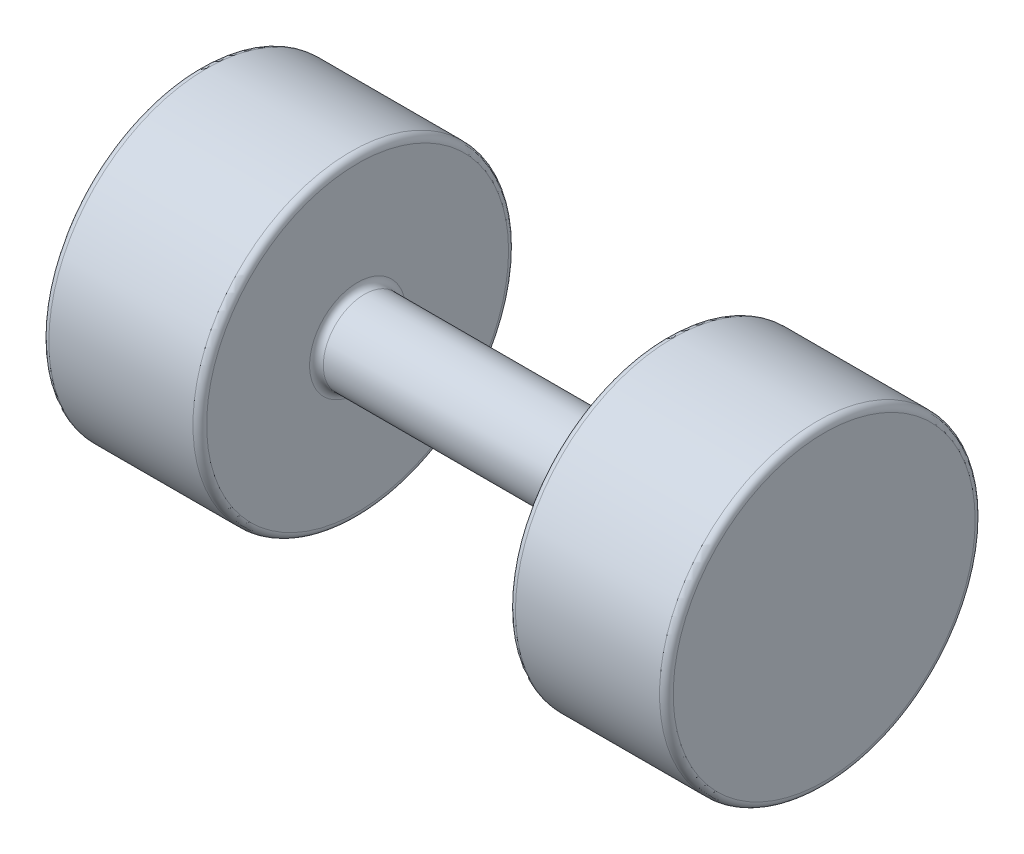
ISO-10303-21;
HEADER;
FILE_DESCRIPTION(('STEP AP214'),'2;1');
FILE_NAME('part.step','',(''),(''),'','','');
FILE_SCHEMA(('AUTOMOTIVE_DESIGN { 1 0 10303 214 1 1 1 1 }'));
ENDSEC;
DATA;
#1=APPLICATION_CONTEXT('core data for automotive mechanical design processes');
#2=APPLICATION_PROTOCOL_DEFINITION('international standard','automotive_design',2000,#1);
#3=PRODUCT_CONTEXT('',#1,'mechanical');
#4=PRODUCT('Part','Part','',(#3));
#5=PRODUCT_RELATED_PRODUCT_CATEGORY('part','',(#4));
#6=PRODUCT_DEFINITION_FORMATION('','',#4);
#7=PRODUCT_DEFINITION_CONTEXT('part definition',#1,'design');
#8=PRODUCT_DEFINITION('design','',#6,#7);
#9=PRODUCT_DEFINITION_SHAPE('','',#8);
#10=(LENGTH_UNIT() NAMED_UNIT(*) SI_UNIT(.MILLI.,.METRE.));
#11=(NAMED_UNIT(*) PLANE_ANGLE_UNIT() SI_UNIT($,.RADIAN.));
#12=(NAMED_UNIT(*) SI_UNIT($,.STERADIAN.) SOLID_ANGLE_UNIT());
#13=UNCERTAINTY_MEASURE_WITH_UNIT(LENGTH_MEASURE(1.E-05),#10,'distance_accuracy_value','');
#14=(GEOMETRIC_REPRESENTATION_CONTEXT(3) GLOBAL_UNCERTAINTY_ASSIGNED_CONTEXT((#13)) GLOBAL_UNIT_ASSIGNED_CONTEXT((#10,
#11,#12)) REPRESENTATION_CONTEXT('',''));
#15=CARTESIAN_POINT('',(0.,0.,0.));
#16=DIRECTION('',(0.,0.,1.));
#17=DIRECTION('',(1.,0.,0.));
#18=AXIS2_PLACEMENT_3D('',#15,#16,#17);
#19=CARTESIAN_POINT('',(91.,0.,0.));
#20=DIRECTION('',(1.,0.,0.));
#21=DIRECTION('',(0.,0.,-1.));
#22=AXIS2_PLACEMENT_3D('',#19,#20,#21);
#23=PLANE('',#22);
#24=CARTESIAN_POINT('',(91.,0.,0.));
#25=DIRECTION('',(1.,0.,0.));
#26=DIRECTION('',(0.,0.,-1.));
#27=AXIS2_PLACEMENT_3D('',#24,#25,#26);
#28=CIRCLE('',#27,44.);
#29=CARTESIAN_POINT('',(91.,0.,-44.));
#30=VERTEX_POINT('',#29);
#31=EDGE_CURVE('E58',#30,#30,#28,.T.);
#32=ORIENTED_EDGE('',*,*,#31,.T.);
#33=EDGE_LOOP('',(#32));
#34=FACE_BOUND('',#33,.T.);
#35=ADVANCED_FACE('F35',(#34),#23,.T.);
#36=CARTESIAN_POINT('',(91.,0.,0.));
#37=DIRECTION('',(1.,0.,0.));
#38=DIRECTION('',(0.,0.,-1.));
#39=AXIS2_PLACEMENT_3D('',#36,#37,#38);
#40=CYLINDRICAL_SURFACE('',#39,46.);
#41=CARTESIAN_POINT('',(89.,0.,0.));
#42=DIRECTION('',(1.,0.,0.));
#43=DIRECTION('',(0.,0.,-1.));
#44=AXIS2_PLACEMENT_3D('',#41,#42,#43);
#45=CIRCLE('',#44,46.);
#46=CARTESIAN_POINT('',(89.,0.,-46.));
#47=VERTEX_POINT('',#46);
#48=EDGE_CURVE('E50',#47,#47,#45,.F.);
#49=ORIENTED_EDGE('',*,*,#48,.T.);
#50=EDGE_LOOP('',(#49));
#51=FACE_BOUND('',#50,.T.);
#52=CARTESIAN_POINT('',(47.,0.,0.));
#53=DIRECTION('',(-1.,0.,0.));
#54=DIRECTION('',(0.,0.,1.));
#55=AXIS2_PLACEMENT_3D('',#52,#53,#54);
#56=CIRCLE('',#55,46.);
#57=CARTESIAN_POINT('',(47.,0.,46.));
#58=VERTEX_POINT('',#57);
#59=EDGE_CURVE('E55',#58,#58,#56,.F.);
#60=ORIENTED_EDGE('',*,*,#59,.T.);
#61=EDGE_LOOP('',(#60));
#62=FACE_BOUND('',#61,.T.);
#63=ADVANCED_FACE('F90',(#51,#62),#40,.T.);
#64=CARTESIAN_POINT('',(45.,46.,0.));
#65=DIRECTION('',(-1.,0.,0.));
#66=DIRECTION('',(0.,0.,1.));
#67=AXIS2_PLACEMENT_3D('',#64,#65,#66);
#68=PLANE('',#67);
#69=CARTESIAN_POINT('',(45.,0.,0.));
#70=DIRECTION('',(-1.,0.,0.));
#71=DIRECTION('',(0.,0.,1.));
#72=AXIS2_PLACEMENT_3D('',#69,#70,#71);
#73=CIRCLE('',#72,14.);
#74=CARTESIAN_POINT('',(45.,0.,14.));
#75=VERTEX_POINT('',#74);
#76=EDGE_CURVE('E73',#75,#75,#73,.F.);
#77=ORIENTED_EDGE('',*,*,#76,.T.);
#78=EDGE_LOOP('',(#77));
#79=FACE_BOUND('',#78,.T.);
#80=CARTESIAN_POINT('',(45.,0.,0.));
#81=DIRECTION('',(-1.,0.,0.));
#82=DIRECTION('',(0.,0.,1.));
#83=AXIS2_PLACEMENT_3D('',#80,#81,#82);
#84=CIRCLE('',#83,44.);
#85=CARTESIAN_POINT('',(45.,0.,44.));
#86=VERTEX_POINT('',#85);
#87=EDGE_CURVE('E76',#86,#86,#84,.T.);
#88=ORIENTED_EDGE('',*,*,#87,.T.);
#89=EDGE_LOOP('',(#88));
#90=FACE_BOUND('',#89,.T.);
#91=ADVANCED_FACE('F80',(#79,#90),#68,.T.);
#92=CARTESIAN_POINT('',(91.,0.,0.));
#93=DIRECTION('',(1.,0.,0.));
#94=DIRECTION('',(0.,0.,-1.));
#95=AXIS2_PLACEMENT_3D('',#92,#93,#94);
#96=CYLINDRICAL_SURFACE('',#95,12.);
#97=CARTESIAN_POINT('',(43.,0.,0.));
#98=DIRECTION('',(-1.,0.,0.));
#99=DIRECTION('',(0.,0.,1.));
#100=AXIS2_PLACEMENT_3D('',#97,#98,#99);
#101=CIRCLE('',#100,12.);
#102=CARTESIAN_POINT('',(43.,0.,12.));
#103=VERTEX_POINT('',#102);
#104=EDGE_CURVE('E67',#103,#103,#101,.T.);
#105=ORIENTED_EDGE('',*,*,#104,.T.);
#106=EDGE_LOOP('',(#105));
#107=FACE_BOUND('',#106,.T.);
#108=CARTESIAN_POINT('',(-43.,0.,0.));
#109=DIRECTION('',(1.,0.,0.));
#110=DIRECTION('',(0.,0.,-1.));
#111=AXIS2_PLACEMENT_3D('',#108,#109,#110);
#112=CIRCLE('',#111,12.);
#113=CARTESIAN_POINT('',(-43.,0.,-12.));
#114=VERTEX_POINT('',#113);
#115=EDGE_CURVE('E70',#114,#114,#112,.T.);
#116=ORIENTED_EDGE('',*,*,#115,.T.);
#117=EDGE_LOOP('',(#116));
#118=FACE_BOUND('',#117,.T.);
#119=ADVANCED_FACE('F98',(#107,#118),#96,.T.);
#120=CARTESIAN_POINT('',(-45.,46.,0.));
#121=DIRECTION('',(1.,0.,0.));
#122=DIRECTION('',(0.,0.,-1.));
#123=AXIS2_PLACEMENT_3D('',#120,#121,#122);
#124=PLANE('',#123);
#125=CARTESIAN_POINT('',(-45.,0.,0.));
#126=DIRECTION('',(1.,0.,0.));
#127=DIRECTION('',(0.,0.,-1.));
#128=AXIS2_PLACEMENT_3D('',#125,#126,#127);
#129=CIRCLE('',#128,14.);
#130=CARTESIAN_POINT('',(-45.,0.,-14.));
#131=VERTEX_POINT('',#130);
#132=EDGE_CURVE('E61',#131,#131,#129,.F.);
#133=ORIENTED_EDGE('',*,*,#132,.T.);
#134=EDGE_LOOP('',(#133));
#135=FACE_BOUND('',#134,.T.);
#136=CARTESIAN_POINT('',(-45.,0.,0.));
#137=DIRECTION('',(1.,0.,0.));
#138=DIRECTION('',(0.,0.,-1.));
#139=AXIS2_PLACEMENT_3D('',#136,#137,#138);
#140=CIRCLE('',#139,44.);
#141=CARTESIAN_POINT('',(-45.,0.,-44.));
#142=VERTEX_POINT('',#141);
#143=EDGE_CURVE('E64',#142,#142,#140,.T.);
#144=ORIENTED_EDGE('',*,*,#143,.T.);
#145=EDGE_LOOP('',(#144));
#146=FACE_BOUND('',#145,.T.);
#147=ADVANCED_FACE('F125',(#135,#146),#124,.T.);
#148=CARTESIAN_POINT('',(91.,0.,0.));
#149=DIRECTION('',(1.,0.,0.));
#150=DIRECTION('',(0.,0.,-1.));
#151=AXIS2_PLACEMENT_3D('',#148,#149,#150);
#152=CYLINDRICAL_SURFACE('',#151,46.);
#153=CARTESIAN_POINT('',(-47.,0.,0.));
#154=DIRECTION('',(1.,0.,0.));
#155=DIRECTION('',(0.,0.,-1.));
#156=AXIS2_PLACEMENT_3D('',#153,#154,#155);
#157=CIRCLE('',#156,46.);
#158=CARTESIAN_POINT('',(-47.,0.,-46.));
#159=VERTEX_POINT('',#158);
#160=EDGE_CURVE('E42',#159,#159,#157,.F.);
#161=ORIENTED_EDGE('',*,*,#160,.T.);
#162=EDGE_LOOP('',(#161));
#163=FACE_BOUND('',#162,.T.);
#164=CARTESIAN_POINT('',(-89.,0.,0.));
#165=DIRECTION('',(-1.,0.,0.));
#166=DIRECTION('',(0.,0.,1.));
#167=AXIS2_PLACEMENT_3D('',#164,#165,#166);
#168=CIRCLE('',#167,46.);
#169=CARTESIAN_POINT('',(-89.,0.,46.));
#170=VERTEX_POINT('',#169);
#171=EDGE_CURVE('E46',#170,#170,#168,.F.);
#172=ORIENTED_EDGE('',*,*,#171,.T.);
#173=EDGE_LOOP('',(#172));
#174=FACE_BOUND('',#173,.T.);
#175=ADVANCED_FACE('F127',(#163,#174),#152,.T.);
#176=CARTESIAN_POINT('',(-91.,0.,0.));
#177=DIRECTION('',(-1.,0.,0.));
#178=DIRECTION('',(0.,0.,1.));
#179=AXIS2_PLACEMENT_3D('',#176,#177,#178);
#180=PLANE('',#179);
#181=CARTESIAN_POINT('',(-91.,0.,0.));
#182=DIRECTION('',(-1.,0.,0.));
#183=DIRECTION('',(0.,0.,1.));
#184=AXIS2_PLACEMENT_3D('',#181,#182,#183);
#185=CIRCLE('',#184,44.);
#186=CARTESIAN_POINT('',(-91.,0.,44.));
#187=VERTEX_POINT('',#186);
#188=EDGE_CURVE('E10',#187,#187,#185,.T.);
#189=ORIENTED_EDGE('',*,*,#188,.T.);
#190=EDGE_LOOP('',(#189));
#191=FACE_BOUND('',#190,.T.);
#192=ADVANCED_FACE('F109',(#191),#180,.T.);
#193=CARTESIAN_POINT('',(43.,0.,0.));
#194=DIRECTION('',(-1.,0.,0.));
#195=DIRECTION('',(0.,0.,1.));
#196=AXIS2_PLACEMENT_3D('',#193,#194,#195);
#197=TOROIDAL_SURFACE('',#196,14.,2.);
#198=ORIENTED_EDGE('',*,*,#104,.F.);
#199=EDGE_LOOP('',(#198));
#200=FACE_BOUND('',#199,.T.);
#201=ORIENTED_EDGE('',*,*,#76,.F.);
#202=EDGE_LOOP('',(#201));
#203=FACE_BOUND('',#202,.T.);
#204=ADVANCED_FACE('F105',(#200,#203),#197,.F.);
#205=CARTESIAN_POINT('',(-43.,0.,0.));
#206=DIRECTION('',(1.,0.,0.));
#207=DIRECTION('',(0.,0.,-1.));
#208=AXIS2_PLACEMENT_3D('',#205,#206,#207);
#209=TOROIDAL_SURFACE('',#208,14.,2.);
#210=ORIENTED_EDGE('',*,*,#132,.F.);
#211=EDGE_LOOP('',(#210));
#212=FACE_BOUND('',#211,.T.);
#213=ORIENTED_EDGE('',*,*,#115,.F.);
#214=EDGE_LOOP('',(#213));
#215=FACE_BOUND('',#214,.T.);
#216=ADVANCED_FACE('F108',(#212,#215),#209,.F.);
#217=CARTESIAN_POINT('',(89.,0.,0.));
#218=DIRECTION('',(1.,0.,0.));
#219=DIRECTION('',(0.,0.,-1.));
#220=AXIS2_PLACEMENT_3D('',#217,#218,#219);
#221=TOROIDAL_SURFACE('',#220,44.,2.);
#222=ORIENTED_EDGE('',*,*,#48,.F.);
#223=EDGE_LOOP('',(#222));
#224=FACE_BOUND('',#223,.T.);
#225=ORIENTED_EDGE('',*,*,#31,.F.);
#226=EDGE_LOOP('',(#225));
#227=FACE_BOUND('',#226,.T.);
#228=ADVANCED_FACE('F86',(#224,#227),#221,.T.);
#229=CARTESIAN_POINT('',(47.,0.,0.));
#230=DIRECTION('',(-1.,0.,0.));
#231=DIRECTION('',(0.,0.,1.));
#232=AXIS2_PLACEMENT_3D('',#229,#230,#231);
#233=TOROIDAL_SURFACE('',#232,44.,2.);
#234=ORIENTED_EDGE('',*,*,#87,.F.);
#235=EDGE_LOOP('',(#234));
#236=FACE_BOUND('',#235,.T.);
#237=ORIENTED_EDGE('',*,*,#59,.F.);
#238=EDGE_LOOP('',(#237));
#239=FACE_BOUND('',#238,.T.);
#240=ADVANCED_FACE('F82',(#236,#239),#233,.T.);
#241=CARTESIAN_POINT('',(-47.,0.,0.));
#242=DIRECTION('',(1.,0.,0.));
#243=DIRECTION('',(0.,0.,-1.));
#244=AXIS2_PLACEMENT_3D('',#241,#242,#243);
#245=TOROIDAL_SURFACE('',#244,44.,2.);
#246=ORIENTED_EDGE('',*,*,#160,.F.);
#247=EDGE_LOOP('',(#246));
#248=FACE_BOUND('',#247,.T.);
#249=ORIENTED_EDGE('',*,*,#143,.F.);
#250=EDGE_LOOP('',(#249));
#251=FACE_BOUND('',#250,.T.);
#252=ADVANCED_FACE('F85',(#248,#251),#245,.T.);
#253=CARTESIAN_POINT('',(-89.,0.,0.));
#254=DIRECTION('',(-1.,0.,0.));
#255=DIRECTION('',(0.,0.,1.));
#256=AXIS2_PLACEMENT_3D('',#253,#254,#255);
#257=TOROIDAL_SURFACE('',#256,44.,2.);
#258=ORIENTED_EDGE('',*,*,#188,.F.);
#259=EDGE_LOOP('',(#258));
#260=FACE_BOUND('',#259,.T.);
#261=ORIENTED_EDGE('',*,*,#171,.F.);
#262=EDGE_LOOP('',(#261));
#263=FACE_BOUND('',#262,.T.);
#264=ADVANCED_FACE('F37',(#260,#263),#257,.T.);
#265=CLOSED_SHELL('',(#35,#63,#91,#119,#147,#175,#192,#204,#216,#228,#240,#252,#264));
#266=MANIFOLD_SOLID_BREP('B2',#265);
#267=ADVANCED_BREP_SHAPE_REPRESENTATION('',(#18,#266),#14);
#268=SHAPE_DEFINITION_REPRESENTATION(#9,#267);
ENDSEC;
END-ISO-10303-21;
